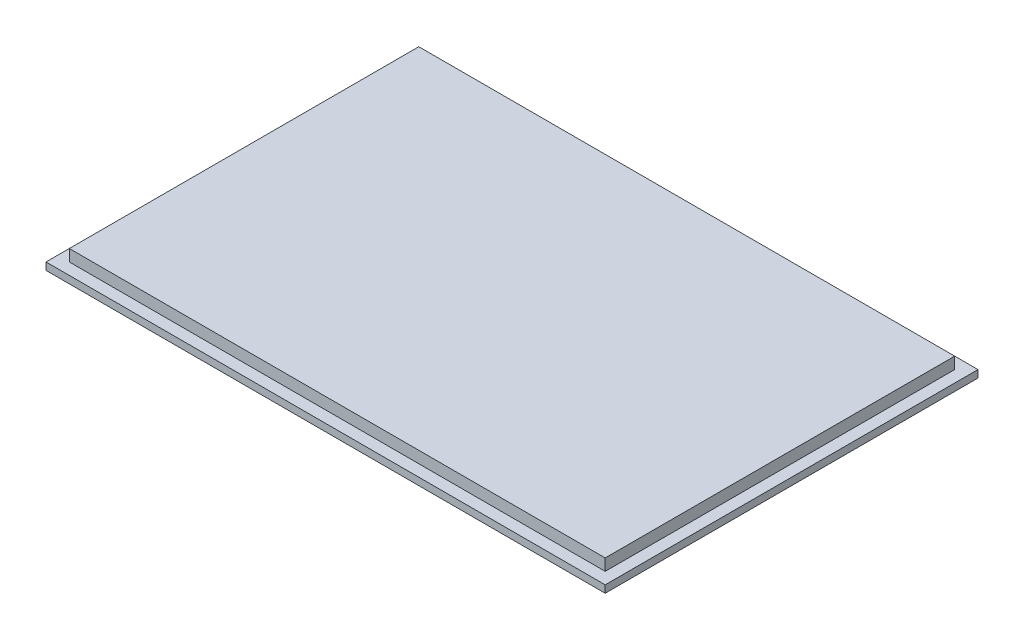
ISO-10303-21;
HEADER;
FILE_DESCRIPTION(('STEP AP214'),'2;1');
FILE_NAME('part.step','',(''),(''),'','','');
FILE_SCHEMA(('AUTOMOTIVE_DESIGN { 1 0 10303 214 1 1 1 1 }'));
ENDSEC;
DATA;
#1=APPLICATION_CONTEXT('core data for automotive mechanical design processes');
#2=APPLICATION_PROTOCOL_DEFINITION('international standard','automotive_design',2000,#1);
#3=PRODUCT_CONTEXT('',#1,'mechanical');
#4=PRODUCT('Part','Part','',(#3));
#5=PRODUCT_RELATED_PRODUCT_CATEGORY('part','',(#4));
#6=PRODUCT_DEFINITION_FORMATION('','',#4);
#7=PRODUCT_DEFINITION_CONTEXT('part definition',#1,'design');
#8=PRODUCT_DEFINITION('design','',#6,#7);
#9=PRODUCT_DEFINITION_SHAPE('','',#8);
#10=(LENGTH_UNIT() NAMED_UNIT(*) SI_UNIT(.MILLI.,.METRE.));
#11=(NAMED_UNIT(*) PLANE_ANGLE_UNIT() SI_UNIT($,.RADIAN.));
#12=(NAMED_UNIT(*) SI_UNIT($,.STERADIAN.) SOLID_ANGLE_UNIT());
#13=UNCERTAINTY_MEASURE_WITH_UNIT(LENGTH_MEASURE(1.E-05),#10,'distance_accuracy_value','');
#14=(GEOMETRIC_REPRESENTATION_CONTEXT(3) GLOBAL_UNCERTAINTY_ASSIGNED_CONTEXT((#13)) GLOBAL_UNIT_ASSIGNED_CONTEXT((#10,
#11,#12)) REPRESENTATION_CONTEXT('',''));
#15=CARTESIAN_POINT('',(0.,0.,0.));
#16=DIRECTION('',(0.,0.,1.));
#17=DIRECTION('',(1.,0.,0.));
#18=AXIS2_PLACEMENT_3D('',#15,#16,#17);
#19=CARTESIAN_POINT('',(-89.7367328519856,2.,-52.2671480144404));
#20=DIRECTION('',(0.,0.,-1.));
#21=DIRECTION('',(-1.,0.,0.));
#22=AXIS2_PLACEMENT_3D('',#19,#20,#21);
#23=PLANE('',#22);
#24=DIRECTION('',(1.,0.,0.));
#25=VECTOR('',#24,1.);
#26=CARTESIAN_POINT('',(-89.7367328519856,0.,-52.2671480144404));
#27=LINE('',#26,#25);
#28=CARTESIAN_POINT('',(-89.7367328519856,0.,-52.2671480144404));
#29=VERTEX_POINT('',#28);
#30=CARTESIAN_POINT('',(62.6632671480144,0.,-52.2671480144404));
#31=VERTEX_POINT('',#30);
#32=EDGE_CURVE('E159',#29,#31,#27,.T.);
#33=ORIENTED_EDGE('',*,*,#32,.F.);
#34=DIRECTION('',(0.,-1.,0.));
#35=VECTOR('',#34,1.);
#36=CARTESIAN_POINT('',(-89.7367328519856,2.,-52.2671480144404));
#37=LINE('',#36,#35);
#38=CARTESIAN_POINT('',(-89.7367328519856,2.,-52.2671480144404));
#39=VERTEX_POINT('',#38);
#40=EDGE_CURVE('E11',#39,#29,#37,.T.);
#41=ORIENTED_EDGE('',*,*,#40,.F.);
#42=DIRECTION('',(1.,0.,0.));
#43=VECTOR('',#42,1.);
#44=CARTESIAN_POINT('',(-89.7367328519856,2.,-52.2671480144404));
#45=LINE('',#44,#43);
#46=CARTESIAN_POINT('',(62.6632671480144,2.,-52.2671480144404));
#47=VERTEX_POINT('',#46);
#48=EDGE_CURVE('E160',#39,#47,#45,.T.);
#49=ORIENTED_EDGE('',*,*,#48,.T.);
#50=DIRECTION('',(0.,-1.,0.));
#51=VECTOR('',#50,1.);
#52=CARTESIAN_POINT('',(62.6632671480144,2.,-52.2671480144404));
#53=LINE('',#52,#51);
#54=EDGE_CURVE('E48',#47,#31,#53,.T.);
#55=ORIENTED_EDGE('',*,*,#54,.T.);
#56=EDGE_LOOP('',(#33,#41,#49,#55));
#57=FACE_BOUND('',#56,.T.);
#58=ADVANCED_FACE('F45',(#57),#23,.T.);
#59=CARTESIAN_POINT('',(-89.7367328519856,2.,-52.2671480144404));
#60=DIRECTION('',(1.,0.,0.));
#61=DIRECTION('',(0.,0.,-1.));
#62=AXIS2_PLACEMENT_3D('',#59,#60,#61);
#63=PLANE('',#62);
#64=DIRECTION('',(0.,0.,1.));
#65=VECTOR('',#64,1.);
#66=CARTESIAN_POINT('',(-89.7367328519856,0.,-52.2671480144404));
#67=LINE('',#66,#65);
#68=CARTESIAN_POINT('',(-89.7367328519856,0.,49.3328519855596));
#69=VERTEX_POINT('',#68);
#70=EDGE_CURVE('E165',#29,#69,#67,.T.);
#71=ORIENTED_EDGE('',*,*,#70,.T.);
#72=DIRECTION('',(0.,-1.,0.));
#73=VECTOR('',#72,1.);
#74=CARTESIAN_POINT('',(-89.7367328519856,2.,49.3328519855596));
#75=LINE('',#74,#73);
#76=CARTESIAN_POINT('',(-89.7367328519856,2.,49.3328519855596));
#77=VERTEX_POINT('',#76);
#78=EDGE_CURVE('E54',#77,#69,#75,.T.);
#79=ORIENTED_EDGE('',*,*,#78,.F.);
#80=DIRECTION('',(0.,0.,1.));
#81=VECTOR('',#80,1.);
#82=CARTESIAN_POINT('',(-89.7367328519856,2.,-52.2671480144404));
#83=LINE('',#82,#81);
#84=EDGE_CURVE('E172',#39,#77,#83,.T.);
#85=ORIENTED_EDGE('',*,*,#84,.F.);
#86=ORIENTED_EDGE('',*,*,#40,.T.);
#87=EDGE_LOOP('',(#71,#79,#85,#86));
#88=FACE_BOUND('',#87,.T.);
#89=ADVANCED_FACE('F207',(#88),#63,.F.);
#90=CARTESIAN_POINT('',(-89.7367328519856,2.,49.3328519855596));
#91=DIRECTION('',(0.,0.,-1.));
#92=DIRECTION('',(-1.,0.,0.));
#93=AXIS2_PLACEMENT_3D('',#90,#91,#92);
#94=PLANE('',#93);
#95=DIRECTION('',(1.,0.,0.));
#96=VECTOR('',#95,1.);
#97=CARTESIAN_POINT('',(-89.7367328519856,0.,49.3328519855596));
#98=LINE('',#97,#96);
#99=CARTESIAN_POINT('',(62.6632671480144,0.,49.3328519855596));
#100=VERTEX_POINT('',#99);
#101=EDGE_CURVE('E182',#69,#100,#98,.T.);
#102=ORIENTED_EDGE('',*,*,#101,.T.);
#103=DIRECTION('',(0.,-1.,0.));
#104=VECTOR('',#103,1.);
#105=CARTESIAN_POINT('',(62.6632671480144,2.,49.3328519855596));
#106=LINE('',#105,#104);
#107=CARTESIAN_POINT('',(62.6632671480144,2.,49.3328519855596));
#108=VERTEX_POINT('',#107);
#109=EDGE_CURVE('E190',#108,#100,#106,.T.);
#110=ORIENTED_EDGE('',*,*,#109,.F.);
#111=DIRECTION('',(1.,0.,0.));
#112=VECTOR('',#111,1.);
#113=CARTESIAN_POINT('',(-89.7367328519856,2.,49.3328519855596));
#114=LINE('',#113,#112);
#115=EDGE_CURVE('E169',#77,#108,#114,.T.);
#116=ORIENTED_EDGE('',*,*,#115,.F.);
#117=ORIENTED_EDGE('',*,*,#78,.T.);
#118=EDGE_LOOP('',(#102,#110,#116,#117));
#119=FACE_BOUND('',#118,.T.);
#120=ADVANCED_FACE('F211',(#119),#94,.F.);
#121=CARTESIAN_POINT('',(62.6632671480144,2.,-52.2671480144404));
#122=DIRECTION('',(1.,0.,0.));
#123=DIRECTION('',(0.,0.,-1.));
#124=AXIS2_PLACEMENT_3D('',#121,#122,#123);
#125=PLANE('',#124);
#126=DIRECTION('',(0.,0.,1.));
#127=VECTOR('',#126,1.);
#128=CARTESIAN_POINT('',(62.6632671480144,0.,-52.2671480144404));
#129=LINE('',#128,#127);
#130=EDGE_CURVE('E178',#31,#100,#129,.T.);
#131=ORIENTED_EDGE('',*,*,#130,.F.);
#132=ORIENTED_EDGE('',*,*,#54,.F.);
#133=DIRECTION('',(0.,0.,1.));
#134=VECTOR('',#133,1.);
#135=CARTESIAN_POINT('',(62.6632671480144,2.,-52.2671480144404));
#136=LINE('',#135,#134);
#137=EDGE_CURVE('E164',#47,#108,#136,.T.);
#138=ORIENTED_EDGE('',*,*,#137,.T.);
#139=ORIENTED_EDGE('',*,*,#109,.T.);
#140=EDGE_LOOP('',(#131,#132,#138,#139));
#141=FACE_BOUND('',#140,.T.);
#142=ADVANCED_FACE('F200',(#141),#125,.T.);
#143=CARTESIAN_POINT('',(0.,2.,0.));
#144=DIRECTION('',(0.,-1.,0.));
#145=DIRECTION('',(0.,0.,-1.));
#146=AXIS2_PLACEMENT_3D('',#143,#144,#145);
#147=PLANE('',#146);
#148=DIRECTION('',(1.,0.,0.));
#149=VECTOR('',#148,1.);
#150=CARTESIAN_POINT('',(0.,2.,-49.0921480144404));
#151=LINE('',#150,#149);
#152=CARTESIAN_POINT('',(-86.5617328519856,2.,-49.0921480144404));
#153=VERTEX_POINT('',#152);
#154=CARTESIAN_POINT('',(59.4882671480144,2.,-49.0921480144404));
#155=VERTEX_POINT('',#154);
#156=EDGE_CURVE('E62',#153,#155,#151,.T.);
#157=ORIENTED_EDGE('',*,*,#156,.T.);
#158=DIRECTION('',(0.,0.,1.));
#159=VECTOR('',#158,1.);
#160=CARTESIAN_POINT('',(59.4882671480144,2.,0.));
#161=LINE('',#160,#159);
#162=CARTESIAN_POINT('',(59.4882671480144,2.,46.1578519855596));
#163=VERTEX_POINT('',#162);
#164=EDGE_CURVE('E114',#155,#163,#161,.T.);
#165=ORIENTED_EDGE('',*,*,#164,.T.);
#166=DIRECTION('',(1.,0.,0.));
#167=VECTOR('',#166,1.);
#168=CARTESIAN_POINT('',(0.,2.,46.1578519855596));
#169=LINE('',#168,#167);
#170=CARTESIAN_POINT('',(-86.5617328519856,2.,46.1578519855596));
#171=VERTEX_POINT('',#170);
#172=EDGE_CURVE('E118',#171,#163,#169,.T.);
#173=ORIENTED_EDGE('',*,*,#172,.F.);
#174=DIRECTION('',(0.,0.,1.));
#175=VECTOR('',#174,1.);
#176=CARTESIAN_POINT('',(-86.5617328519856,2.,0.));
#177=LINE('',#176,#175);
#178=EDGE_CURVE('E67',#153,#171,#177,.T.);
#179=ORIENTED_EDGE('',*,*,#178,.F.);
#180=EDGE_LOOP('',(#157,#165,#173,#179));
#181=FACE_BOUND('',#180,.T.);
#182=ORIENTED_EDGE('',*,*,#48,.F.);
#183=ORIENTED_EDGE('',*,*,#84,.T.);
#184=ORIENTED_EDGE('',*,*,#115,.T.);
#185=ORIENTED_EDGE('',*,*,#137,.F.);
#186=EDGE_LOOP('',(#182,#183,#184,#185));
#187=FACE_BOUND('',#186,.T.);
#188=ADVANCED_FACE('F213',(#181,#187),#147,.F.);
#189=CARTESIAN_POINT('',(0.,0.,0.));
#190=DIRECTION('',(0.,-1.,0.));
#191=DIRECTION('',(0.,0.,-1.));
#192=AXIS2_PLACEMENT_3D('',#189,#190,#191);
#193=PLANE('',#192);
#194=ORIENTED_EDGE('',*,*,#32,.T.);
#195=ORIENTED_EDGE('',*,*,#130,.T.);
#196=ORIENTED_EDGE('',*,*,#101,.F.);
#197=ORIENTED_EDGE('',*,*,#70,.F.);
#198=EDGE_LOOP('',(#194,#195,#196,#197));
#199=FACE_BOUND('',#198,.T.);
#200=ADVANCED_FACE('F204',(#199),#193,.T.);
#201=CARTESIAN_POINT('',(59.4882671480144,5.175,0.));
#202=DIRECTION('',(1.,0.,0.));
#203=DIRECTION('',(0.,0.,-1.));
#204=AXIS2_PLACEMENT_3D('',#201,#202,#203);
#205=PLANE('',#204);
#206=ORIENTED_EDGE('',*,*,#164,.F.);
#207=DIRECTION('',(0.,-1.,0.));
#208=VECTOR('',#207,1.);
#209=CARTESIAN_POINT('',(59.4882671480144,5.175,-49.0921480144404));
#210=LINE('',#209,#208);
#211=CARTESIAN_POINT('',(59.4882671480144,5.175,-49.0921480144404));
#212=VERTEX_POINT('',#211);
#213=EDGE_CURVE('E109',#212,#155,#210,.T.);
#214=ORIENTED_EDGE('',*,*,#213,.F.);
#215=DIRECTION('',(0.,0.,1.));
#216=VECTOR('',#215,1.);
#217=CARTESIAN_POINT('',(59.4882671480144,5.175,0.));
#218=LINE('',#217,#216);
#219=CARTESIAN_POINT('',(59.4882671480144,5.175,46.1578519855596));
#220=VERTEX_POINT('',#219);
#221=EDGE_CURVE('E113',#212,#220,#218,.T.);
#222=ORIENTED_EDGE('',*,*,#221,.T.);
#223=DIRECTION('',(0.,-1.,0.));
#224=VECTOR('',#223,1.);
#225=CARTESIAN_POINT('',(59.4882671480144,5.175,46.1578519855596));
#226=LINE('',#225,#224);
#227=EDGE_CURVE('E141',#220,#163,#226,.T.);
#228=ORIENTED_EDGE('',*,*,#227,.T.);
#229=EDGE_LOOP('',(#206,#214,#222,#228));
#230=FACE_BOUND('',#229,.T.);
#231=ADVANCED_FACE('F111',(#230),#205,.T.);
#232=CARTESIAN_POINT('',(0.,5.175,-49.0921480144404));
#233=DIRECTION('',(0.,0.,-1.));
#234=DIRECTION('',(-1.,0.,0.));
#235=AXIS2_PLACEMENT_3D('',#232,#233,#234);
#236=PLANE('',#235);
#237=ORIENTED_EDGE('',*,*,#156,.F.);
#238=DIRECTION('',(0.,-1.,0.));
#239=VECTOR('',#238,1.);
#240=CARTESIAN_POINT('',(-86.5617328519856,5.175,-49.0921480144404));
#241=LINE('',#240,#239);
#242=CARTESIAN_POINT('',(-86.5617328519856,5.175,-49.0921480144404));
#243=VERTEX_POINT('',#242);
#244=EDGE_CURVE('E119',#243,#153,#241,.T.);
#245=ORIENTED_EDGE('',*,*,#244,.F.);
#246=DIRECTION('',(1.,0.,0.));
#247=VECTOR('',#246,1.);
#248=CARTESIAN_POINT('',(0.,5.175,-49.0921480144404));
#249=LINE('',#248,#247);
#250=EDGE_CURVE('E124',#243,#212,#249,.T.);
#251=ORIENTED_EDGE('',*,*,#250,.T.);
#252=ORIENTED_EDGE('',*,*,#213,.T.);
#253=EDGE_LOOP('',(#237,#245,#251,#252));
#254=FACE_BOUND('',#253,.T.);
#255=ADVANCED_FACE('F130',(#254),#236,.T.);
#256=CARTESIAN_POINT('',(-86.5617328519856,5.175,0.));
#257=DIRECTION('',(1.,0.,0.));
#258=DIRECTION('',(0.,0.,-1.));
#259=AXIS2_PLACEMENT_3D('',#256,#257,#258);
#260=PLANE('',#259);
#261=ORIENTED_EDGE('',*,*,#244,.T.);
#262=ORIENTED_EDGE('',*,*,#178,.T.);
#263=DIRECTION('',(0.,-1.,0.));
#264=VECTOR('',#263,1.);
#265=CARTESIAN_POINT('',(-86.5617328519856,5.175,46.1578519855596));
#266=LINE('',#265,#264);
#267=CARTESIAN_POINT('',(-86.5617328519856,5.175,46.1578519855596));
#268=VERTEX_POINT('',#267);
#269=EDGE_CURVE('E144',#268,#171,#266,.T.);
#270=ORIENTED_EDGE('',*,*,#269,.F.);
#271=DIRECTION('',(0.,0.,1.));
#272=VECTOR('',#271,1.);
#273=CARTESIAN_POINT('',(-86.5617328519856,5.175,0.));
#274=LINE('',#273,#272);
#275=EDGE_CURVE('E134',#243,#268,#274,.T.);
#276=ORIENTED_EDGE('',*,*,#275,.F.);
#277=EDGE_LOOP('',(#261,#262,#270,#276));
#278=FACE_BOUND('',#277,.T.);
#279=ADVANCED_FACE('F265',(#278),#260,.F.);
#280=CARTESIAN_POINT('',(0.,5.175,46.1578519855596));
#281=DIRECTION('',(0.,0.,-1.));
#282=DIRECTION('',(-1.,0.,0.));
#283=AXIS2_PLACEMENT_3D('',#280,#281,#282);
#284=PLANE('',#283);
#285=ORIENTED_EDGE('',*,*,#269,.T.);
#286=ORIENTED_EDGE('',*,*,#172,.T.);
#287=ORIENTED_EDGE('',*,*,#227,.F.);
#288=DIRECTION('',(1.,0.,0.));
#289=VECTOR('',#288,1.);
#290=CARTESIAN_POINT('',(0.,5.175,46.1578519855596));
#291=LINE('',#290,#289);
#292=EDGE_CURVE('E126',#268,#220,#291,.T.);
#293=ORIENTED_EDGE('',*,*,#292,.F.);
#294=EDGE_LOOP('',(#285,#286,#287,#293));
#295=FACE_BOUND('',#294,.T.);
#296=ADVANCED_FACE('F274',(#295),#284,.F.);
#297=CARTESIAN_POINT('',(0.,5.175,0.));
#298=DIRECTION('',(0.,1.,0.));
#299=DIRECTION('',(0.,0.,1.));
#300=AXIS2_PLACEMENT_3D('',#297,#298,#299);
#301=PLANE('',#300);
#302=ORIENTED_EDGE('',*,*,#221,.F.);
#303=ORIENTED_EDGE('',*,*,#250,.F.);
#304=ORIENTED_EDGE('',*,*,#275,.T.);
#305=ORIENTED_EDGE('',*,*,#292,.T.);
#306=EDGE_LOOP('',(#302,#303,#304,#305));
#307=FACE_BOUND('',#306,.T.);
#308=ADVANCED_FACE('F123',(#307),#301,.T.);
#309=CLOSED_SHELL('',(#58,#89,#120,#142,#188,#200,#231,#255,#279,#296,#308));
#310=MANIFOLD_SOLID_BREP('B2',#309);
#311=ADVANCED_BREP_SHAPE_REPRESENTATION('',(#18,#310),#14);
#312=SHAPE_DEFINITION_REPRESENTATION(#9,#311);
ENDSEC;
END-ISO-10303-21;
